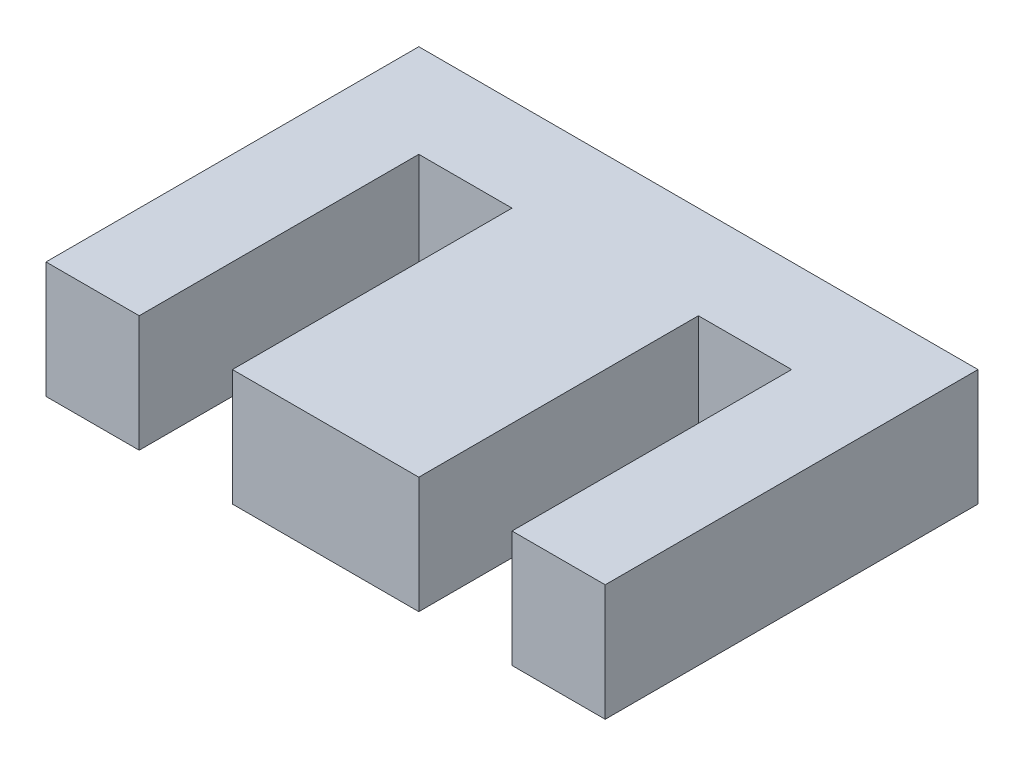
ISO-10303-21;
HEADER;
FILE_DESCRIPTION(('STEP AP214'),'2;1');
FILE_NAME('part.step','',(''),(''),'','','');
FILE_SCHEMA(('AUTOMOTIVE_DESIGN { 1 0 10303 214 1 1 1 1 }'));
ENDSEC;
DATA;
#1=APPLICATION_CONTEXT('core data for automotive mechanical design processes');
#2=APPLICATION_PROTOCOL_DEFINITION('international standard','automotive_design',2000,#1);
#3=PRODUCT_CONTEXT('',#1,'mechanical');
#4=PRODUCT('Part','Part','',(#3));
#5=PRODUCT_RELATED_PRODUCT_CATEGORY('part','',(#4));
#6=PRODUCT_DEFINITION_FORMATION('','',#4);
#7=PRODUCT_DEFINITION_CONTEXT('part definition',#1,'design');
#8=PRODUCT_DEFINITION('design','',#6,#7);
#9=PRODUCT_DEFINITION_SHAPE('','',#8);
#10=(LENGTH_UNIT() NAMED_UNIT(*) SI_UNIT(.MILLI.,.METRE.));
#11=(NAMED_UNIT(*) PLANE_ANGLE_UNIT() SI_UNIT($,.RADIAN.));
#12=(NAMED_UNIT(*) SI_UNIT($,.STERADIAN.) SOLID_ANGLE_UNIT());
#13=UNCERTAINTY_MEASURE_WITH_UNIT(LENGTH_MEASURE(1.E-05),#10,'distance_accuracy_value','');
#14=(GEOMETRIC_REPRESENTATION_CONTEXT(3) GLOBAL_UNCERTAINTY_ASSIGNED_CONTEXT((#13)) GLOBAL_UNIT_ASSIGNED_CONTEXT((#10,
#11,#12)) REPRESENTATION_CONTEXT('',''));
#15=CARTESIAN_POINT('',(0.,0.,0.));
#16=DIRECTION('',(0.,0.,1.));
#17=DIRECTION('',(1.,0.,0.));
#18=AXIS2_PLACEMENT_3D('',#15,#16,#17);
#19=CARTESIAN_POINT('',(24.,10.,16.));
#20=DIRECTION('',(-1.,0.,0.));
#21=DIRECTION('',(0.,0.,1.));
#22=AXIS2_PLACEMENT_3D('',#19,#20,#21);
#23=PLANE('',#22);
#24=DIRECTION('',(0.,0.,-1.));
#25=VECTOR('',#24,1.);
#26=CARTESIAN_POINT('',(24.,0.,16.));
#27=LINE('',#26,#25);
#28=CARTESIAN_POINT('',(24.,0.,16.));
#29=VERTEX_POINT('',#28);
#30=CARTESIAN_POINT('',(24.,0.,-16.));
#31=VERTEX_POINT('',#30);
#32=EDGE_CURVE('E152',#29,#31,#27,.T.);
#33=ORIENTED_EDGE('',*,*,#32,.T.);
#34=DIRECTION('',(0.,-1.,0.));
#35=VECTOR('',#34,1.);
#36=CARTESIAN_POINT('',(24.,10.,-16.));
#37=LINE('',#36,#35);
#38=CARTESIAN_POINT('',(24.,10.,-16.));
#39=VERTEX_POINT('',#38);
#40=EDGE_CURVE('E11',#39,#31,#37,.T.);
#41=ORIENTED_EDGE('',*,*,#40,.F.);
#42=DIRECTION('',(0.,0.,-1.));
#43=VECTOR('',#42,1.);
#44=CARTESIAN_POINT('',(24.,10.,16.));
#45=LINE('',#44,#43);
#46=CARTESIAN_POINT('',(24.,10.,16.));
#47=VERTEX_POINT('',#46);
#48=EDGE_CURVE('E174',#47,#39,#45,.T.);
#49=ORIENTED_EDGE('',*,*,#48,.F.);
#50=DIRECTION('',(0.,-1.,0.));
#51=VECTOR('',#50,1.);
#52=CARTESIAN_POINT('',(24.,10.,16.));
#53=LINE('',#52,#51);
#54=EDGE_CURVE('E148',#47,#29,#53,.T.);
#55=ORIENTED_EDGE('',*,*,#54,.T.);
#56=EDGE_LOOP('',(#33,#41,#49,#55));
#57=FACE_BOUND('',#56,.T.);
#58=ADVANCED_FACE('F32',(#57),#23,.F.);
#59=CARTESIAN_POINT('',(-24.,10.,-16.));
#60=DIRECTION('',(0.,0.,1.));
#61=DIRECTION('',(1.,0.,0.));
#62=AXIS2_PLACEMENT_3D('',#59,#60,#61);
#63=PLANE('',#62);
#64=DIRECTION('',(-1.,0.,0.));
#65=VECTOR('',#64,1.);
#66=CARTESIAN_POINT('',(-24.,0.,-16.));
#67=LINE('',#66,#65);
#68=CARTESIAN_POINT('',(-24.,0.,-16.));
#69=VERTEX_POINT('',#68);
#70=EDGE_CURVE('E155',#31,#69,#67,.T.);
#71=ORIENTED_EDGE('',*,*,#70,.T.);
#72=DIRECTION('',(0.,-1.,0.));
#73=VECTOR('',#72,1.);
#74=CARTESIAN_POINT('',(-24.,10.,-16.));
#75=LINE('',#74,#73);
#76=CARTESIAN_POINT('',(-24.,10.,-16.));
#77=VERTEX_POINT('',#76);
#78=EDGE_CURVE('E40',#77,#69,#75,.T.);
#79=ORIENTED_EDGE('',*,*,#78,.F.);
#80=DIRECTION('',(-1.,0.,0.));
#81=VECTOR('',#80,1.);
#82=CARTESIAN_POINT('',(-24.,10.,-16.));
#83=LINE('',#82,#81);
#84=EDGE_CURVE('E103',#39,#77,#83,.T.);
#85=ORIENTED_EDGE('',*,*,#84,.F.);
#86=ORIENTED_EDGE('',*,*,#40,.T.);
#87=EDGE_LOOP('',(#71,#79,#85,#86));
#88=FACE_BOUND('',#87,.T.);
#89=ADVANCED_FACE('F252',(#88),#63,.F.);
#90=CARTESIAN_POINT('',(-24.,10.,16.));
#91=DIRECTION('',(1.,0.,0.));
#92=DIRECTION('',(0.,0.,-1.));
#93=AXIS2_PLACEMENT_3D('',#90,#91,#92);
#94=PLANE('',#93);
#95=DIRECTION('',(0.,0.,1.));
#96=VECTOR('',#95,1.);
#97=CARTESIAN_POINT('',(-24.,0.,16.));
#98=LINE('',#97,#96);
#99=CARTESIAN_POINT('',(-24.,0.,16.));
#100=VERTEX_POINT('',#99);
#101=EDGE_CURVE('E157',#69,#100,#98,.T.);
#102=ORIENTED_EDGE('',*,*,#101,.T.);
#103=DIRECTION('',(0.,-1.,0.));
#104=VECTOR('',#103,1.);
#105=CARTESIAN_POINT('',(-24.,10.,16.));
#106=LINE('',#105,#104);
#107=CARTESIAN_POINT('',(-24.,10.,16.));
#108=VERTEX_POINT('',#107);
#109=EDGE_CURVE('E193',#108,#100,#106,.T.);
#110=ORIENTED_EDGE('',*,*,#109,.F.);
#111=DIRECTION('',(0.,0.,1.));
#112=VECTOR('',#111,1.);
#113=CARTESIAN_POINT('',(-24.,10.,16.));
#114=LINE('',#113,#112);
#115=EDGE_CURVE('E201',#77,#108,#114,.T.);
#116=ORIENTED_EDGE('',*,*,#115,.F.);
#117=ORIENTED_EDGE('',*,*,#78,.T.);
#118=EDGE_LOOP('',(#102,#110,#116,#117));
#119=FACE_BOUND('',#118,.T.);
#120=ADVANCED_FACE('F199',(#119),#94,.F.);
#121=CARTESIAN_POINT('',(-24.,10.,16.));
#122=DIRECTION('',(0.,0.,-1.));
#123=DIRECTION('',(-1.,0.,0.));
#124=AXIS2_PLACEMENT_3D('',#121,#122,#123);
#125=PLANE('',#124);
#126=DIRECTION('',(1.,0.,0.));
#127=VECTOR('',#126,1.);
#128=CARTESIAN_POINT('',(-24.,0.,16.));
#129=LINE('',#128,#127);
#130=CARTESIAN_POINT('',(-16.,0.,16.));
#131=VERTEX_POINT('',#130);
#132=EDGE_CURVE('E159',#100,#131,#129,.T.);
#133=ORIENTED_EDGE('',*,*,#132,.T.);
#134=DIRECTION('',(0.,-1.,0.));
#135=VECTOR('',#134,1.);
#136=CARTESIAN_POINT('',(-16.,10.,16.));
#137=LINE('',#136,#135);
#138=CARTESIAN_POINT('',(-16.,10.,16.));
#139=VERTEX_POINT('',#138);
#140=EDGE_CURVE('E190',#139,#131,#137,.T.);
#141=ORIENTED_EDGE('',*,*,#140,.F.);
#142=DIRECTION('',(1.,0.,0.));
#143=VECTOR('',#142,1.);
#144=CARTESIAN_POINT('',(-24.,10.,16.));
#145=LINE('',#144,#143);
#146=EDGE_CURVE('E219',#108,#139,#145,.T.);
#147=ORIENTED_EDGE('',*,*,#146,.F.);
#148=ORIENTED_EDGE('',*,*,#109,.T.);
#149=EDGE_LOOP('',(#133,#141,#147,#148));
#150=FACE_BOUND('',#149,.T.);
#151=ADVANCED_FACE('F210',(#150),#125,.F.);
#152=CARTESIAN_POINT('',(-16.,10.,16.));
#153=DIRECTION('',(-1.,0.,0.));
#154=DIRECTION('',(0.,0.,1.));
#155=AXIS2_PLACEMENT_3D('',#152,#153,#154);
#156=PLANE('',#155);
#157=DIRECTION('',(0.,0.,-1.));
#158=VECTOR('',#157,1.);
#159=CARTESIAN_POINT('',(-16.,0.,16.));
#160=LINE('',#159,#158);
#161=CARTESIAN_POINT('',(-16.,0.,-8.));
#162=VERTEX_POINT('',#161);
#163=EDGE_CURVE('E161',#131,#162,#160,.T.);
#164=ORIENTED_EDGE('',*,*,#163,.T.);
#165=DIRECTION('',(0.,-1.,0.));
#166=VECTOR('',#165,1.);
#167=CARTESIAN_POINT('',(-16.,10.,-8.));
#168=LINE('',#167,#166);
#169=CARTESIAN_POINT('',(-16.,10.,-8.));
#170=VERTEX_POINT('',#169);
#171=EDGE_CURVE('E187',#170,#162,#168,.T.);
#172=ORIENTED_EDGE('',*,*,#171,.F.);
#173=DIRECTION('',(0.,0.,-1.));
#174=VECTOR('',#173,1.);
#175=CARTESIAN_POINT('',(-16.,10.,16.));
#176=LINE('',#175,#174);
#177=EDGE_CURVE('E216',#139,#170,#176,.T.);
#178=ORIENTED_EDGE('',*,*,#177,.F.);
#179=ORIENTED_EDGE('',*,*,#140,.T.);
#180=EDGE_LOOP('',(#164,#172,#178,#179));
#181=FACE_BOUND('',#180,.T.);
#182=ADVANCED_FACE('F214',(#181),#156,.F.);
#183=CARTESIAN_POINT('',(-16.,10.,-8.));
#184=DIRECTION('',(0.,0.,-1.));
#185=DIRECTION('',(-1.,0.,0.));
#186=AXIS2_PLACEMENT_3D('',#183,#184,#185);
#187=PLANE('',#186);
#188=DIRECTION('',(1.,0.,0.));
#189=VECTOR('',#188,1.);
#190=CARTESIAN_POINT('',(-16.,0.,-8.));
#191=LINE('',#190,#189);
#192=CARTESIAN_POINT('',(-8.,0.,-8.));
#193=VERTEX_POINT('',#192);
#194=EDGE_CURVE('E163',#162,#193,#191,.T.);
#195=ORIENTED_EDGE('',*,*,#194,.T.);
#196=DIRECTION('',(0.,-1.,0.));
#197=VECTOR('',#196,1.);
#198=CARTESIAN_POINT('',(-8.,10.,-8.));
#199=LINE('',#198,#197);
#200=CARTESIAN_POINT('',(-8.,10.,-8.));
#201=VERTEX_POINT('',#200);
#202=EDGE_CURVE('E184',#201,#193,#199,.T.);
#203=ORIENTED_EDGE('',*,*,#202,.F.);
#204=DIRECTION('',(1.,0.,0.));
#205=VECTOR('',#204,1.);
#206=CARTESIAN_POINT('',(-16.,10.,-8.));
#207=LINE('',#206,#205);
#208=EDGE_CURVE('E218',#170,#201,#207,.T.);
#209=ORIENTED_EDGE('',*,*,#208,.F.);
#210=ORIENTED_EDGE('',*,*,#171,.T.);
#211=EDGE_LOOP('',(#195,#203,#209,#210));
#212=FACE_BOUND('',#211,.T.);
#213=ADVANCED_FACE('F265',(#212),#187,.F.);
#214=CARTESIAN_POINT('',(-8.,10.,16.));
#215=DIRECTION('',(1.,0.,0.));
#216=DIRECTION('',(0.,0.,-1.));
#217=AXIS2_PLACEMENT_3D('',#214,#215,#216);
#218=PLANE('',#217);
#219=DIRECTION('',(0.,0.,1.));
#220=VECTOR('',#219,1.);
#221=CARTESIAN_POINT('',(-8.,0.,16.));
#222=LINE('',#221,#220);
#223=CARTESIAN_POINT('',(-8.,0.,16.));
#224=VERTEX_POINT('',#223);
#225=EDGE_CURVE('E165',#193,#224,#222,.T.);
#226=ORIENTED_EDGE('',*,*,#225,.T.);
#227=DIRECTION('',(0.,-1.,0.));
#228=VECTOR('',#227,1.);
#229=CARTESIAN_POINT('',(-8.,10.,16.));
#230=LINE('',#229,#228);
#231=CARTESIAN_POINT('',(-8.,10.,16.));
#232=VERTEX_POINT('',#231);
#233=EDGE_CURVE('E181',#232,#224,#230,.T.);
#234=ORIENTED_EDGE('',*,*,#233,.F.);
#235=DIRECTION('',(0.,0.,1.));
#236=VECTOR('',#235,1.);
#237=CARTESIAN_POINT('',(-8.,10.,16.));
#238=LINE('',#237,#236);
#239=EDGE_CURVE('E221',#201,#232,#238,.T.);
#240=ORIENTED_EDGE('',*,*,#239,.F.);
#241=ORIENTED_EDGE('',*,*,#202,.T.);
#242=EDGE_LOOP('',(#226,#234,#240,#241));
#243=FACE_BOUND('',#242,.T.);
#244=ADVANCED_FACE('F268',(#243),#218,.F.);
#245=CARTESIAN_POINT('',(-8.,10.,16.));
#246=DIRECTION('',(0.,0.,-1.));
#247=DIRECTION('',(-1.,0.,0.));
#248=AXIS2_PLACEMENT_3D('',#245,#246,#247);
#249=PLANE('',#248);
#250=DIRECTION('',(1.,0.,0.));
#251=VECTOR('',#250,1.);
#252=CARTESIAN_POINT('',(-8.,0.,16.));
#253=LINE('',#252,#251);
#254=CARTESIAN_POINT('',(8.,0.,16.));
#255=VERTEX_POINT('',#254);
#256=EDGE_CURVE('E167',#224,#255,#253,.T.);
#257=ORIENTED_EDGE('',*,*,#256,.T.);
#258=DIRECTION('',(0.,-1.,0.));
#259=VECTOR('',#258,1.);
#260=CARTESIAN_POINT('',(8.,10.,16.));
#261=LINE('',#260,#259);
#262=CARTESIAN_POINT('',(8.,10.,16.));
#263=VERTEX_POINT('',#262);
#264=EDGE_CURVE('E178',#263,#255,#261,.T.);
#265=ORIENTED_EDGE('',*,*,#264,.F.);
#266=DIRECTION('',(1.,0.,0.));
#267=VECTOR('',#266,1.);
#268=CARTESIAN_POINT('',(-8.,10.,16.));
#269=LINE('',#268,#267);
#270=EDGE_CURVE('E227',#232,#263,#269,.T.);
#271=ORIENTED_EDGE('',*,*,#270,.F.);
#272=ORIENTED_EDGE('',*,*,#233,.T.);
#273=EDGE_LOOP('',(#257,#265,#271,#272));
#274=FACE_BOUND('',#273,.T.);
#275=ADVANCED_FACE('F233',(#274),#249,.F.);
#276=CARTESIAN_POINT('',(8.,10.,16.));
#277=DIRECTION('',(-1.,0.,0.));
#278=DIRECTION('',(0.,0.,1.));
#279=AXIS2_PLACEMENT_3D('',#276,#277,#278);
#280=PLANE('',#279);
#281=DIRECTION('',(0.,0.,-1.));
#282=VECTOR('',#281,1.);
#283=CARTESIAN_POINT('',(8.,0.,16.));
#284=LINE('',#283,#282);
#285=CARTESIAN_POINT('',(8.,0.,-8.));
#286=VERTEX_POINT('',#285);
#287=EDGE_CURVE('E169',#255,#286,#284,.T.);
#288=ORIENTED_EDGE('',*,*,#287,.T.);
#289=DIRECTION('',(0.,-1.,0.));
#290=VECTOR('',#289,1.);
#291=CARTESIAN_POINT('',(8.,10.,-8.));
#292=LINE('',#291,#290);
#293=CARTESIAN_POINT('',(8.,10.,-8.));
#294=VERTEX_POINT('',#293);
#295=EDGE_CURVE('E143',#294,#286,#292,.T.);
#296=ORIENTED_EDGE('',*,*,#295,.F.);
#297=DIRECTION('',(0.,0.,-1.));
#298=VECTOR('',#297,1.);
#299=CARTESIAN_POINT('',(8.,10.,16.));
#300=LINE('',#299,#298);
#301=EDGE_CURVE('E134',#263,#294,#300,.T.);
#302=ORIENTED_EDGE('',*,*,#301,.F.);
#303=ORIENTED_EDGE('',*,*,#264,.T.);
#304=EDGE_LOOP('',(#288,#296,#302,#303));
#305=FACE_BOUND('',#304,.T.);
#306=ADVANCED_FACE('F237',(#305),#280,.F.);
#307=CARTESIAN_POINT('',(16.,10.,-8.));
#308=DIRECTION('',(0.,0.,-1.));
#309=DIRECTION('',(-1.,0.,0.));
#310=AXIS2_PLACEMENT_3D('',#307,#308,#309);
#311=PLANE('',#310);
#312=DIRECTION('',(1.,0.,0.));
#313=VECTOR('',#312,1.);
#314=CARTESIAN_POINT('',(16.,0.,-8.));
#315=LINE('',#314,#313);
#316=CARTESIAN_POINT('',(16.,0.,-8.));
#317=VERTEX_POINT('',#316);
#318=EDGE_CURVE('E142',#286,#317,#315,.T.);
#319=ORIENTED_EDGE('',*,*,#318,.T.);
#320=DIRECTION('',(0.,-1.,0.));
#321=VECTOR('',#320,1.);
#322=CARTESIAN_POINT('',(16.,10.,-8.));
#323=LINE('',#322,#321);
#324=CARTESIAN_POINT('',(16.,10.,-8.));
#325=VERTEX_POINT('',#324);
#326=EDGE_CURVE('E139',#325,#317,#323,.T.);
#327=ORIENTED_EDGE('',*,*,#326,.F.);
#328=DIRECTION('',(1.,0.,0.));
#329=VECTOR('',#328,1.);
#330=CARTESIAN_POINT('',(16.,10.,-8.));
#331=LINE('',#330,#329);
#332=EDGE_CURVE('E128',#294,#325,#331,.T.);
#333=ORIENTED_EDGE('',*,*,#332,.F.);
#334=ORIENTED_EDGE('',*,*,#295,.T.);
#335=EDGE_LOOP('',(#319,#327,#333,#334));
#336=FACE_BOUND('',#335,.T.);
#337=ADVANCED_FACE('F140',(#336),#311,.F.);
#338=CARTESIAN_POINT('',(16.,10.,16.));
#339=DIRECTION('',(1.,0.,0.));
#340=DIRECTION('',(0.,0.,-1.));
#341=AXIS2_PLACEMENT_3D('',#338,#339,#340);
#342=PLANE('',#341);
#343=DIRECTION('',(0.,0.,1.));
#344=VECTOR('',#343,1.);
#345=CARTESIAN_POINT('',(16.,0.,16.));
#346=LINE('',#345,#344);
#347=CARTESIAN_POINT('',(16.,0.,16.));
#348=VERTEX_POINT('',#347);
#349=EDGE_CURVE('E89',#317,#348,#346,.T.);
#350=ORIENTED_EDGE('',*,*,#349,.T.);
#351=DIRECTION('',(0.,-1.,0.));
#352=VECTOR('',#351,1.);
#353=CARTESIAN_POINT('',(16.,10.,16.));
#354=LINE('',#353,#352);
#355=CARTESIAN_POINT('',(16.,10.,16.));
#356=VERTEX_POINT('',#355);
#357=EDGE_CURVE('E144',#356,#348,#354,.T.);
#358=ORIENTED_EDGE('',*,*,#357,.F.);
#359=DIRECTION('',(0.,0.,1.));
#360=VECTOR('',#359,1.);
#361=CARTESIAN_POINT('',(16.,10.,16.));
#362=LINE('',#361,#360);
#363=EDGE_CURVE('E132',#325,#356,#362,.T.);
#364=ORIENTED_EDGE('',*,*,#363,.F.);
#365=ORIENTED_EDGE('',*,*,#326,.T.);
#366=EDGE_LOOP('',(#350,#358,#364,#365));
#367=FACE_BOUND('',#366,.T.);
#368=ADVANCED_FACE('F146',(#367),#342,.F.);
#369=CARTESIAN_POINT('',(16.,10.,16.));
#370=DIRECTION('',(0.,0.,-1.));
#371=DIRECTION('',(-1.,0.,0.));
#372=AXIS2_PLACEMENT_3D('',#369,#370,#371);
#373=PLANE('',#372);
#374=DIRECTION('',(1.,0.,0.));
#375=VECTOR('',#374,1.);
#376=CARTESIAN_POINT('',(16.,0.,16.));
#377=LINE('',#376,#375);
#378=EDGE_CURVE('E95',#348,#29,#377,.T.);
#379=ORIENTED_EDGE('',*,*,#378,.T.);
#380=ORIENTED_EDGE('',*,*,#54,.F.);
#381=DIRECTION('',(1.,0.,0.));
#382=VECTOR('',#381,1.);
#383=CARTESIAN_POINT('',(16.,10.,16.));
#384=LINE('',#383,#382);
#385=EDGE_CURVE('E48',#356,#47,#384,.T.);
#386=ORIENTED_EDGE('',*,*,#385,.F.);
#387=ORIENTED_EDGE('',*,*,#357,.T.);
#388=EDGE_LOOP('',(#379,#380,#386,#387));
#389=FACE_BOUND('',#388,.T.);
#390=ADVANCED_FACE('F241',(#389),#373,.F.);
#391=CARTESIAN_POINT('',(24.,10.,-16.));
#392=DIRECTION('',(0.,-1.,0.));
#393=DIRECTION('',(0.,0.,-1.));
#394=AXIS2_PLACEMENT_3D('',#391,#392,#393);
#395=PLANE('',#394);
#396=ORIENTED_EDGE('',*,*,#48,.T.);
#397=ORIENTED_EDGE('',*,*,#84,.T.);
#398=ORIENTED_EDGE('',*,*,#115,.T.);
#399=ORIENTED_EDGE('',*,*,#146,.T.);
#400=ORIENTED_EDGE('',*,*,#177,.T.);
#401=ORIENTED_EDGE('',*,*,#208,.T.);
#402=ORIENTED_EDGE('',*,*,#239,.T.);
#403=ORIENTED_EDGE('',*,*,#270,.T.);
#404=ORIENTED_EDGE('',*,*,#301,.T.);
#405=ORIENTED_EDGE('',*,*,#332,.T.);
#406=ORIENTED_EDGE('',*,*,#363,.T.);
#407=ORIENTED_EDGE('',*,*,#385,.T.);
#408=EDGE_LOOP('',(#396,#397,#398,#399,#400,#401,#402,#403,#404,#405,#406,#407));
#409=FACE_BOUND('',#408,.T.);
#410=ADVANCED_FACE('F130',(#409),#395,.F.);
#411=CARTESIAN_POINT('',(24.,0.,-16.));
#412=DIRECTION('',(0.,-1.,0.));
#413=DIRECTION('',(0.,0.,-1.));
#414=AXIS2_PLACEMENT_3D('',#411,#412,#413);
#415=PLANE('',#414);
#416=ORIENTED_EDGE('',*,*,#32,.F.);
#417=ORIENTED_EDGE('',*,*,#378,.F.);
#418=ORIENTED_EDGE('',*,*,#349,.F.);
#419=ORIENTED_EDGE('',*,*,#318,.F.);
#420=ORIENTED_EDGE('',*,*,#287,.F.);
#421=ORIENTED_EDGE('',*,*,#256,.F.);
#422=ORIENTED_EDGE('',*,*,#225,.F.);
#423=ORIENTED_EDGE('',*,*,#194,.F.);
#424=ORIENTED_EDGE('',*,*,#163,.F.);
#425=ORIENTED_EDGE('',*,*,#132,.F.);
#426=ORIENTED_EDGE('',*,*,#101,.F.);
#427=ORIENTED_EDGE('',*,*,#70,.F.);
#428=EDGE_LOOP('',(#416,#417,#418,#419,#420,#421,#422,#423,#424,#425,#426,#427));
#429=FACE_BOUND('',#428,.T.);
#430=ADVANCED_FACE('F205',(#429),#415,.T.);
#431=CLOSED_SHELL('',(#58,#89,#120,#151,#182,#213,#244,#275,#306,#337,#368,#390,#410,#430));
#432=MANIFOLD_SOLID_BREP('B2',#431);
#433=ADVANCED_BREP_SHAPE_REPRESENTATION('',(#18,#432),#14);
#434=SHAPE_DEFINITION_REPRESENTATION(#9,#433);
ENDSEC;
END-ISO-10303-21;
